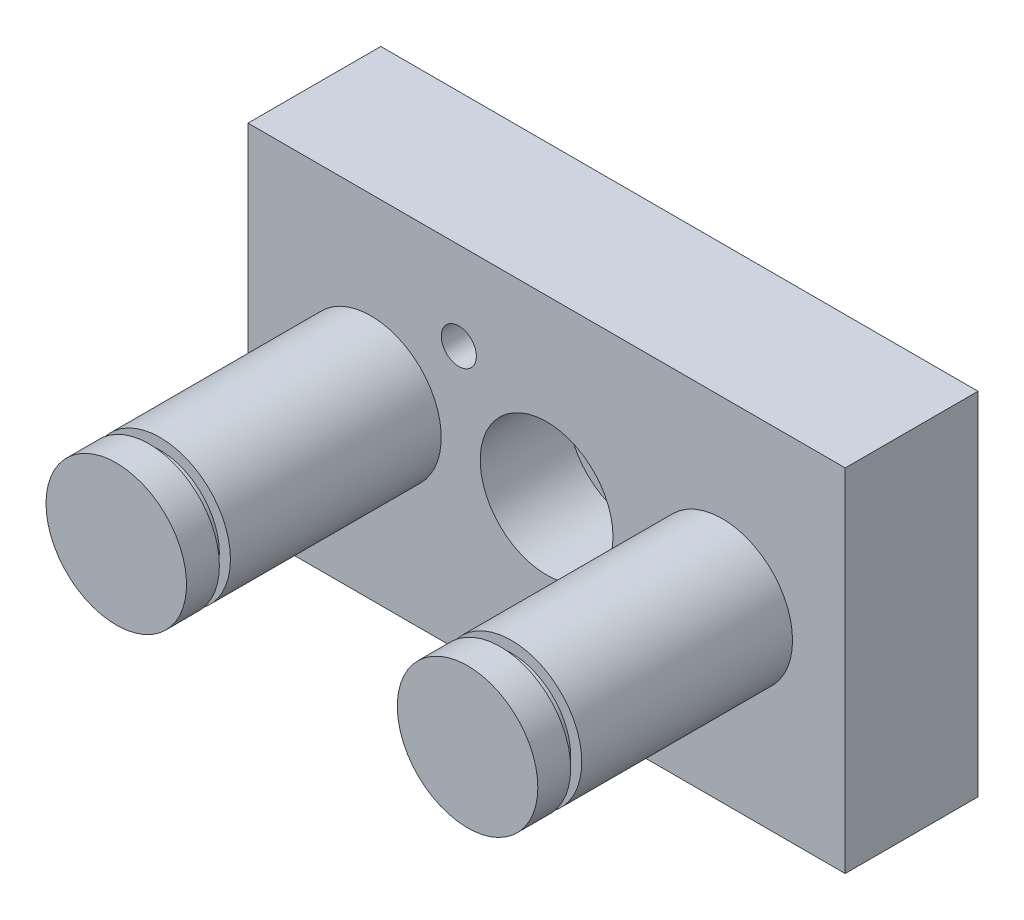
ISO-10303-21;
HEADER;
FILE_DESCRIPTION(('STEP AP214'),'2;1');
FILE_NAME('part.step','',(''),(''),'','','');
FILE_SCHEMA(('AUTOMOTIVE_DESIGN { 1 0 10303 214 1 1 1 1 }'));
ENDSEC;
DATA;
#1=APPLICATION_CONTEXT('core data for automotive mechanical design processes');
#2=APPLICATION_PROTOCOL_DEFINITION('international standard','automotive_design',2000,#1);
#3=PRODUCT_CONTEXT('',#1,'mechanical');
#4=PRODUCT('Part','Part','',(#3));
#5=PRODUCT_RELATED_PRODUCT_CATEGORY('part','',(#4));
#6=PRODUCT_DEFINITION_FORMATION('','',#4);
#7=PRODUCT_DEFINITION_CONTEXT('part definition',#1,'design');
#8=PRODUCT_DEFINITION('design','',#6,#7);
#9=PRODUCT_DEFINITION_SHAPE('','',#8);
#10=(LENGTH_UNIT() NAMED_UNIT(*) SI_UNIT(.MILLI.,.METRE.));
#11=(NAMED_UNIT(*) PLANE_ANGLE_UNIT() SI_UNIT($,.RADIAN.));
#12=(NAMED_UNIT(*) SI_UNIT($,.STERADIAN.) SOLID_ANGLE_UNIT());
#13=UNCERTAINTY_MEASURE_WITH_UNIT(LENGTH_MEASURE(1.E-05),#10,'distance_accuracy_value','');
#14=(GEOMETRIC_REPRESENTATION_CONTEXT(3) GLOBAL_UNCERTAINTY_ASSIGNED_CONTEXT((#13)) GLOBAL_UNIT_ASSIGNED_CONTEXT((#10,
#11,#12)) REPRESENTATION_CONTEXT('',''));
#15=CARTESIAN_POINT('',(0.,0.,0.));
#16=DIRECTION('',(0.,0.,1.));
#17=DIRECTION('',(1.,0.,0.));
#18=AXIS2_PLACEMENT_3D('',#15,#16,#17);
#19=CARTESIAN_POINT('',(15.875,0.,12.));
#20=DIRECTION('',(0.,0.,1.));
#21=DIRECTION('',(1.,0.,0.));
#22=AXIS2_PLACEMENT_3D('',#19,#20,#21);
#23=CYLINDRICAL_SURFACE('',#22,6.35);
#24=CARTESIAN_POINT('',(15.875,0.,31.05));
#25=DIRECTION('',(0.,0.,1.));
#26=DIRECTION('',(1.,0.,0.));
#27=AXIS2_PLACEMENT_3D('',#24,#25,#26);
#28=CIRCLE('',#27,6.35);
#29=CARTESIAN_POINT('',(22.225,0.,31.05));
#30=VERTEX_POINT('',#29);
#31=EDGE_CURVE('E61',#30,#30,#28,.T.);
#32=ORIENTED_EDGE('',*,*,#31,.F.);
#33=EDGE_LOOP('',(#32));
#34=FACE_BOUND('',#33,.T.);
#35=CARTESIAN_POINT('',(15.875,0.,12.));
#36=DIRECTION('',(0.,0.,1.));
#37=DIRECTION('',(1.,0.,0.));
#38=AXIS2_PLACEMENT_3D('',#35,#36,#37);
#39=CIRCLE('',#38,6.35);
#40=CARTESIAN_POINT('',(22.225,0.,12.));
#41=VERTEX_POINT('',#40);
#42=EDGE_CURVE('E48',#41,#41,#39,.T.);
#43=ORIENTED_EDGE('',*,*,#42,.T.);
#44=EDGE_LOOP('',(#43));
#45=FACE_BOUND('',#44,.T.);
#46=ADVANCED_FACE('F41',(#34,#45),#23,.T.);
#47=CARTESIAN_POINT('',(11.906,0.,1.19099999999999));
#48=DIRECTION('',(0.,0.,1.));
#49=DIRECTION('',(1.,0.,0.));
#50=AXIS2_PLACEMENT_3D('',#47,#48,#49);
#51=PLANE('',#50);
#52=CARTESIAN_POINT('',(15.875,0.,1.19099999999999));
#53=DIRECTION('',(0.,0.,1.));
#54=DIRECTION('',(1.,0.,0.));
#55=AXIS2_PLACEMENT_3D('',#52,#53,#54);
#56=CIRCLE('',#55,3.969);
#57=CARTESIAN_POINT('',(19.844,0.,1.19099999999999));
#58=VERTEX_POINT('',#57);
#59=EDGE_CURVE('E56',#58,#58,#56,.T.);
#60=ORIENTED_EDGE('',*,*,#59,.F.);
#61=EDGE_LOOP('',(#60));
#62=FACE_BOUND('',#61,.T.);
#63=ADVANCED_FACE('F43',(#62),#51,.F.);
#64=CARTESIAN_POINT('',(9.525,0.,12.));
#65=DIRECTION('',(0.,0.,1.));
#66=DIRECTION('',(1.,0.,0.));
#67=AXIS2_PLACEMENT_3D('',#64,#65,#66);
#68=PLANE('',#67);
#69=ORIENTED_EDGE('',*,*,#42,.F.);
#70=EDGE_LOOP('',(#69));
#71=FACE_BOUND('',#70,.T.);
#72=CARTESIAN_POINT('',(15.875,0.,12.));
#73=DIRECTION('',(0.,0.,1.));
#74=DIRECTION('',(1.,0.,0.));
#75=AXIS2_PLACEMENT_3D('',#72,#73,#74);
#76=CIRCLE('',#75,3.969);
#77=CARTESIAN_POINT('',(19.844,0.,12.));
#78=VERTEX_POINT('',#77);
#79=EDGE_CURVE('E52',#78,#78,#76,.T.);
#80=ORIENTED_EDGE('',*,*,#79,.T.);
#81=EDGE_LOOP('',(#80));
#82=FACE_BOUND('',#81,.T.);
#83=ADVANCED_FACE('F102',(#71,#82),#68,.F.);
#84=CARTESIAN_POINT('',(15.875,0.,12.));
#85=DIRECTION('',(0.,0.,1.));
#86=DIRECTION('',(1.,0.,0.));
#87=AXIS2_PLACEMENT_3D('',#84,#85,#86);
#88=CYLINDRICAL_SURFACE('',#87,3.969);
#89=ORIENTED_EDGE('',*,*,#79,.F.);
#90=EDGE_LOOP('',(#89));
#91=FACE_BOUND('',#90,.T.);
#92=ORIENTED_EDGE('',*,*,#59,.T.);
#93=EDGE_LOOP('',(#92));
#94=FACE_BOUND('',#93,.T.);
#95=ADVANCED_FACE('F93',(#91,#94),#88,.T.);
#96=CARTESIAN_POINT('',(22.225,0.,31.05));
#97=DIRECTION('',(0.,0.,-1.));
#98=DIRECTION('',(-1.,0.,0.));
#99=AXIS2_PLACEMENT_3D('',#96,#97,#98);
#100=PLANE('',#99);
#101=CARTESIAN_POINT('',(15.875,0.,31.05));
#102=DIRECTION('',(0.,0.,1.));
#103=DIRECTION('',(1.,0.,0.));
#104=AXIS2_PLACEMENT_3D('',#101,#102,#103);
#105=CIRCLE('',#104,5.35);
#106=CARTESIAN_POINT('',(21.225,0.,31.05));
#107=VERTEX_POINT('',#106);
#108=EDGE_CURVE('E64',#107,#107,#105,.T.);
#109=ORIENTED_EDGE('',*,*,#108,.F.);
#110=EDGE_LOOP('',(#109));
#111=FACE_BOUND('',#110,.T.);
#112=ORIENTED_EDGE('',*,*,#31,.T.);
#113=EDGE_LOOP('',(#112));
#114=FACE_BOUND('',#113,.T.);
#115=ADVANCED_FACE('F87',(#111,#114),#100,.F.);
#116=CARTESIAN_POINT('',(15.875,0.,35.019));
#117=DIRECTION('',(0.,0.,1.));
#118=DIRECTION('',(1.,0.,0.));
#119=AXIS2_PLACEMENT_3D('',#116,#117,#118);
#120=CYLINDRICAL_SURFACE('',#119,5.35);
#121=CARTESIAN_POINT('',(15.875,0.,32.05));
#122=DIRECTION('',(0.,0.,1.));
#123=DIRECTION('',(1.,0.,0.));
#124=AXIS2_PLACEMENT_3D('',#121,#122,#123);
#125=CIRCLE('',#124,5.35);
#126=CARTESIAN_POINT('',(21.225,0.,32.05));
#127=VERTEX_POINT('',#126);
#128=EDGE_CURVE('E67',#127,#127,#125,.T.);
#129=ORIENTED_EDGE('',*,*,#128,.F.);
#130=EDGE_LOOP('',(#129));
#131=FACE_BOUND('',#130,.T.);
#132=ORIENTED_EDGE('',*,*,#108,.T.);
#133=EDGE_LOOP('',(#132));
#134=FACE_BOUND('',#133,.T.);
#135=ADVANCED_FACE('F81',(#131,#134),#120,.T.);
#136=CARTESIAN_POINT('',(21.225,0.,32.05));
#137=DIRECTION('',(0.,0.,1.));
#138=DIRECTION('',(1.,0.,0.));
#139=AXIS2_PLACEMENT_3D('',#136,#137,#138);
#140=PLANE('',#139);
#141=CARTESIAN_POINT('',(15.875,0.,32.05));
#142=DIRECTION('',(0.,0.,1.));
#143=DIRECTION('',(1.,0.,0.));
#144=AXIS2_PLACEMENT_3D('',#141,#142,#143);
#145=CIRCLE('',#144,6.35);
#146=CARTESIAN_POINT('',(22.225,0.,32.05));
#147=VERTEX_POINT('',#146);
#148=EDGE_CURVE('E70',#147,#147,#145,.T.);
#149=ORIENTED_EDGE('',*,*,#148,.F.);
#150=EDGE_LOOP('',(#149));
#151=FACE_BOUND('',#150,.T.);
#152=ORIENTED_EDGE('',*,*,#128,.T.);
#153=EDGE_LOOP('',(#152));
#154=FACE_BOUND('',#153,.T.);
#155=ADVANCED_FACE('F77',(#151,#154),#140,.F.);
#156=CARTESIAN_POINT('',(15.875,0.,35.019));
#157=DIRECTION('',(0.,0.,-1.));
#158=DIRECTION('',(-1.,0.,0.));
#159=AXIS2_PLACEMENT_3D('',#156,#157,#158);
#160=PLANE('',#159);
#161=CARTESIAN_POINT('',(15.875,0.,35.019));
#162=DIRECTION('',(0.,0.,1.));
#163=DIRECTION('',(1.,0.,0.));
#164=AXIS2_PLACEMENT_3D('',#161,#162,#163);
#165=CIRCLE('',#164,6.35);
#166=CARTESIAN_POINT('',(22.225,0.,35.019));
#167=VERTEX_POINT('',#166);
#168=EDGE_CURVE('E11',#167,#167,#165,.T.);
#169=ORIENTED_EDGE('',*,*,#168,.T.);
#170=EDGE_LOOP('',(#169));
#171=FACE_BOUND('',#170,.T.);
#172=ADVANCED_FACE('F80',(#171),#160,.F.);
#173=ORIENTED_EDGE('',*,*,#148,.T.);
#174=EDGE_LOOP('',(#173));
#175=FACE_BOUND('',#174,.T.);
#176=ORIENTED_EDGE('',*,*,#168,.F.);
#177=EDGE_LOOP('',(#176));
#178=FACE_BOUND('',#177,.T.);
#179=ADVANCED_FACE('F74',(#175,#178),#23,.T.);
#180=CLOSED_SHELL('',(#46,#63,#83,#95,#115,#135,#155,#172,#179));
#181=MANIFOLD_SOLID_BREP('B2',#180);
#182=CARTESIAN_POINT('',(-15.875,0.,0.));
#183=DIRECTION('',(0.,0.,-1.));
#184=DIRECTION('',(-1.,0.,0.));
#185=AXIS2_PLACEMENT_3D('',#182,#183,#184);
#186=CYLINDRICAL_SURFACE('',#185,6.35);
#187=CARTESIAN_POINT('',(-15.875,0.,31.05));
#188=DIRECTION('',(0.,0.,1.));
#189=DIRECTION('',(1.,0.,0.));
#190=AXIS2_PLACEMENT_3D('',#187,#188,#189);
#191=CIRCLE('',#190,6.35);
#192=CARTESIAN_POINT('',(-9.525,0.,31.05));
#193=VERTEX_POINT('',#192);
#194=EDGE_CURVE('E199',#193,#193,#191,.T.);
#195=ORIENTED_EDGE('',*,*,#194,.F.);
#196=EDGE_LOOP('',(#195));
#197=FACE_BOUND('',#196,.T.);
#198=CARTESIAN_POINT('',(-15.875,0.,12.));
#199=DIRECTION('',(0.,0.,-1.));
#200=DIRECTION('',(-1.,0.,0.));
#201=AXIS2_PLACEMENT_3D('',#198,#199,#200);
#202=CIRCLE('',#201,6.35);
#203=CARTESIAN_POINT('',(-22.225,0.,12.));
#204=VERTEX_POINT('',#203);
#205=EDGE_CURVE('E186',#204,#204,#202,.T.);
#206=ORIENTED_EDGE('',*,*,#205,.F.);
#207=EDGE_LOOP('',(#206));
#208=FACE_BOUND('',#207,.T.);
#209=ADVANCED_FACE('F179',(#197,#208),#186,.T.);
#210=CARTESIAN_POINT('',(-11.906,0.,1.19099999999999));
#211=DIRECTION('',(0.,0.,1.));
#212=DIRECTION('',(1.,0.,0.));
#213=AXIS2_PLACEMENT_3D('',#210,#211,#212);
#214=PLANE('',#213);
#215=CARTESIAN_POINT('',(-15.875,0.,1.19099999999999));
#216=DIRECTION('',(0.,0.,-1.));
#217=DIRECTION('',(-1.,0.,0.));
#218=AXIS2_PLACEMENT_3D('',#215,#216,#217);
#219=CIRCLE('',#218,3.969);
#220=CARTESIAN_POINT('',(-19.844,0.,1.19099999999999));
#221=VERTEX_POINT('',#220);
#222=EDGE_CURVE('E194',#221,#221,#219,.T.);
#223=ORIENTED_EDGE('',*,*,#222,.T.);
#224=EDGE_LOOP('',(#223));
#225=FACE_BOUND('',#224,.T.);
#226=ADVANCED_FACE('F181',(#225),#214,.F.);
#227=CARTESIAN_POINT('',(-9.525,0.,12.));
#228=DIRECTION('',(0.,0.,1.));
#229=DIRECTION('',(1.,0.,0.));
#230=AXIS2_PLACEMENT_3D('',#227,#228,#229);
#231=PLANE('',#230);
#232=CARTESIAN_POINT('',(-15.875,0.,12.));
#233=DIRECTION('',(0.,0.,-1.));
#234=DIRECTION('',(-1.,0.,0.));
#235=AXIS2_PLACEMENT_3D('',#232,#233,#234);
#236=CIRCLE('',#235,3.969);
#237=CARTESIAN_POINT('',(-19.844,0.,12.));
#238=VERTEX_POINT('',#237);
#239=EDGE_CURVE('E190',#238,#238,#236,.T.);
#240=ORIENTED_EDGE('',*,*,#239,.F.);
#241=EDGE_LOOP('',(#240));
#242=FACE_BOUND('',#241,.T.);
#243=ORIENTED_EDGE('',*,*,#205,.T.);
#244=EDGE_LOOP('',(#243));
#245=FACE_BOUND('',#244,.T.);
#246=ADVANCED_FACE('F240',(#242,#245),#231,.F.);
#247=CARTESIAN_POINT('',(-15.875,0.,0.));
#248=DIRECTION('',(0.,0.,-1.));
#249=DIRECTION('',(-1.,0.,0.));
#250=AXIS2_PLACEMENT_3D('',#247,#248,#249);
#251=CYLINDRICAL_SURFACE('',#250,3.969);
#252=ORIENTED_EDGE('',*,*,#222,.F.);
#253=EDGE_LOOP('',(#252));
#254=FACE_BOUND('',#253,.T.);
#255=ORIENTED_EDGE('',*,*,#239,.T.);
#256=EDGE_LOOP('',(#255));
#257=FACE_BOUND('',#256,.T.);
#258=ADVANCED_FACE('F230',(#254,#257),#251,.T.);
#259=CARTESIAN_POINT('',(-9.525,0.,31.05));
#260=DIRECTION('',(0.,0.,-1.));
#261=DIRECTION('',(-1.,0.,0.));
#262=AXIS2_PLACEMENT_3D('',#259,#260,#261);
#263=PLANE('',#262);
#264=CARTESIAN_POINT('',(-15.875,0.,31.05));
#265=DIRECTION('',(0.,0.,1.));
#266=DIRECTION('',(1.,0.,0.));
#267=AXIS2_PLACEMENT_3D('',#264,#265,#266);
#268=CIRCLE('',#267,5.35);
#269=CARTESIAN_POINT('',(-10.525,0.,31.05));
#270=VERTEX_POINT('',#269);
#271=EDGE_CURVE('E202',#270,#270,#268,.T.);
#272=ORIENTED_EDGE('',*,*,#271,.F.);
#273=EDGE_LOOP('',(#272));
#274=FACE_BOUND('',#273,.T.);
#275=ORIENTED_EDGE('',*,*,#194,.T.);
#276=EDGE_LOOP('',(#275));
#277=FACE_BOUND('',#276,.T.);
#278=ADVANCED_FACE('F224',(#274,#277),#263,.F.);
#279=CARTESIAN_POINT('',(-15.875,0.,35.019));
#280=DIRECTION('',(0.,0.,1.));
#281=DIRECTION('',(1.,0.,0.));
#282=AXIS2_PLACEMENT_3D('',#279,#280,#281);
#283=CYLINDRICAL_SURFACE('',#282,5.35);
#284=CARTESIAN_POINT('',(-15.875,0.,32.05));
#285=DIRECTION('',(0.,0.,1.));
#286=DIRECTION('',(1.,0.,0.));
#287=AXIS2_PLACEMENT_3D('',#284,#285,#286);
#288=CIRCLE('',#287,5.35);
#289=CARTESIAN_POINT('',(-10.525,0.,32.05));
#290=VERTEX_POINT('',#289);
#291=EDGE_CURVE('E205',#290,#290,#288,.T.);
#292=ORIENTED_EDGE('',*,*,#291,.F.);
#293=EDGE_LOOP('',(#292));
#294=FACE_BOUND('',#293,.T.);
#295=ORIENTED_EDGE('',*,*,#271,.T.);
#296=EDGE_LOOP('',(#295));
#297=FACE_BOUND('',#296,.T.);
#298=ADVANCED_FACE('F218',(#294,#297),#283,.T.);
#299=CARTESIAN_POINT('',(-10.525,0.,32.05));
#300=DIRECTION('',(0.,0.,1.));
#301=DIRECTION('',(1.,0.,0.));
#302=AXIS2_PLACEMENT_3D('',#299,#300,#301);
#303=PLANE('',#302);
#304=CARTESIAN_POINT('',(-15.875,0.,32.05));
#305=DIRECTION('',(0.,0.,1.));
#306=DIRECTION('',(1.,0.,0.));
#307=AXIS2_PLACEMENT_3D('',#304,#305,#306);
#308=CIRCLE('',#307,6.35);
#309=CARTESIAN_POINT('',(-9.525,0.,32.05));
#310=VERTEX_POINT('',#309);
#311=EDGE_CURVE('E208',#310,#310,#308,.T.);
#312=ORIENTED_EDGE('',*,*,#311,.F.);
#313=EDGE_LOOP('',(#312));
#314=FACE_BOUND('',#313,.T.);
#315=ORIENTED_EDGE('',*,*,#291,.T.);
#316=EDGE_LOOP('',(#315));
#317=FACE_BOUND('',#316,.T.);
#318=ADVANCED_FACE('F214',(#314,#317),#303,.F.);
#319=CARTESIAN_POINT('',(-15.875,0.,35.019));
#320=DIRECTION('',(0.,0.,-1.));
#321=DIRECTION('',(-1.,0.,0.));
#322=AXIS2_PLACEMENT_3D('',#319,#320,#321);
#323=PLANE('',#322);
#324=CARTESIAN_POINT('',(-15.875,0.,35.019));
#325=DIRECTION('',(0.,0.,-1.));
#326=DIRECTION('',(-1.,0.,0.));
#327=AXIS2_PLACEMENT_3D('',#324,#325,#326);
#328=CIRCLE('',#327,6.35);
#329=CARTESIAN_POINT('',(-22.225,0.,35.019));
#330=VERTEX_POINT('',#329);
#331=EDGE_CURVE('E40',#330,#330,#328,.T.);
#332=ORIENTED_EDGE('',*,*,#331,.F.);
#333=EDGE_LOOP('',(#332));
#334=FACE_BOUND('',#333,.T.);
#335=ADVANCED_FACE('F217',(#334),#323,.F.);
#336=ORIENTED_EDGE('',*,*,#311,.T.);
#337=EDGE_LOOP('',(#336));
#338=FACE_BOUND('',#337,.T.);
#339=ORIENTED_EDGE('',*,*,#331,.T.);
#340=EDGE_LOOP('',(#339));
#341=FACE_BOUND('',#340,.T.);
#342=ADVANCED_FACE('F212',(#338,#341),#186,.T.);
#343=CLOSED_SHELL('',(#209,#226,#246,#258,#278,#298,#318,#335,#342));
#344=MANIFOLD_SOLID_BREP('B6',#343);
#345=CARTESIAN_POINT('',(0.,0.,0.));
#346=DIRECTION('',(0.,0.,1.));
#347=DIRECTION('',(1.,0.,0.));
#348=AXIS2_PLACEMENT_3D('',#345,#346,#347);
#349=CYLINDRICAL_SURFACE('',#348,3.969);
#350=CARTESIAN_POINT('',(0.,0.,0.));
#351=DIRECTION('',(0.,0.,1.));
#352=DIRECTION('',(1.,0.,0.));
#353=AXIS2_PLACEMENT_3D('',#350,#351,#352);
#354=CIRCLE('',#353,3.969);
#355=CARTESIAN_POINT('',(3.969,0.,0.));
#356=VERTEX_POINT('',#355);
#357=EDGE_CURVE('E377',#356,#356,#354,.T.);
#358=ORIENTED_EDGE('',*,*,#357,.F.);
#359=EDGE_LOOP('',(#358));
#360=FACE_BOUND('',#359,.T.);
#361=CARTESIAN_POINT('',(0.,0.,4.062));
#362=DIRECTION('',(0.,0.,1.));
#363=DIRECTION('',(1.,0.,0.));
#364=AXIS2_PLACEMENT_3D('',#361,#362,#363);
#365=CIRCLE('',#364,3.969);
#366=CARTESIAN_POINT('',(3.969,0.,4.062));
#367=VERTEX_POINT('',#366);
#368=EDGE_CURVE('E312',#367,#367,#365,.F.);
#369=ORIENTED_EDGE('',*,*,#368,.F.);
#370=EDGE_LOOP('',(#369));
#371=FACE_BOUND('',#370,.T.);
#372=ADVANCED_FACE('F308',(#360,#371),#349,.F.);
#373=CARTESIAN_POINT('',(26.9875,15.875,12.));
#374=DIRECTION('',(-1.,0.,0.));
#375=DIRECTION('',(0.,0.,1.));
#376=AXIS2_PLACEMENT_3D('',#373,#374,#375);
#377=PLANE('',#376);
#378=DIRECTION('',(0.,1.,0.));
#379=VECTOR('',#378,1.);
#380=CARTESIAN_POINT('',(26.9875,15.875,0.));
#381=LINE('',#380,#379);
#382=CARTESIAN_POINT('',(26.9875,-15.875,0.));
#383=VERTEX_POINT('',#382);
#384=CARTESIAN_POINT('',(26.9875,15.875,0.));
#385=VERTEX_POINT('',#384);
#386=EDGE_CURVE('E374',#383,#385,#381,.T.);
#387=ORIENTED_EDGE('',*,*,#386,.T.);
#388=DIRECTION('',(0.,0.,-1.));
#389=VECTOR('',#388,1.);
#390=CARTESIAN_POINT('',(26.9875,15.875,12.));
#391=LINE('',#390,#389);
#392=CARTESIAN_POINT('',(26.9875,15.875,12.));
#393=VERTEX_POINT('',#392);
#394=EDGE_CURVE('E177',#393,#385,#391,.T.);
#395=ORIENTED_EDGE('',*,*,#394,.F.);
#396=DIRECTION('',(0.,1.,0.));
#397=VECTOR('',#396,1.);
#398=CARTESIAN_POINT('',(26.9875,15.875,12.));
#399=LINE('',#398,#397);
#400=CARTESIAN_POINT('',(26.9875,-15.875,12.));
#401=VERTEX_POINT('',#400);
#402=EDGE_CURVE('E361',#401,#393,#399,.T.);
#403=ORIENTED_EDGE('',*,*,#402,.F.);
#404=DIRECTION('',(0.,0.,-1.));
#405=VECTOR('',#404,1.);
#406=CARTESIAN_POINT('',(26.9875,-15.875,12.));
#407=LINE('',#406,#405);
#408=EDGE_CURVE('E370',#401,#383,#407,.T.);
#409=ORIENTED_EDGE('',*,*,#408,.T.);
#410=EDGE_LOOP('',(#387,#395,#403,#409));
#411=FACE_BOUND('',#410,.T.);
#412=ADVANCED_FACE('F310',(#411),#377,.F.);
#413=CARTESIAN_POINT('',(-26.9875,15.875,12.));
#414=DIRECTION('',(0.,-1.,0.));
#415=DIRECTION('',(0.,0.,-1.));
#416=AXIS2_PLACEMENT_3D('',#413,#414,#415);
#417=PLANE('',#416);
#418=DIRECTION('',(-1.,0.,0.));
#419=VECTOR('',#418,1.);
#420=CARTESIAN_POINT('',(-26.9875,15.875,0.));
#421=LINE('',#420,#419);
#422=CARTESIAN_POINT('',(-26.9875,15.875,0.));
#423=VERTEX_POINT('',#422);
#424=EDGE_CURVE('E365',#385,#423,#421,.T.);
#425=ORIENTED_EDGE('',*,*,#424,.T.);
#426=DIRECTION('',(0.,0.,-1.));
#427=VECTOR('',#426,1.);
#428=CARTESIAN_POINT('',(-26.9875,15.875,12.));
#429=LINE('',#428,#427);
#430=CARTESIAN_POINT('',(-26.9875,15.875,12.));
#431=VERTEX_POINT('',#430);
#432=EDGE_CURVE('E318',#431,#423,#429,.T.);
#433=ORIENTED_EDGE('',*,*,#432,.F.);
#434=DIRECTION('',(-1.,0.,0.));
#435=VECTOR('',#434,1.);
#436=CARTESIAN_POINT('',(-26.9875,15.875,12.));
#437=LINE('',#436,#435);
#438=EDGE_CURVE('E356',#393,#431,#437,.T.);
#439=ORIENTED_EDGE('',*,*,#438,.F.);
#440=ORIENTED_EDGE('',*,*,#394,.T.);
#441=EDGE_LOOP('',(#425,#433,#439,#440));
#442=FACE_BOUND('',#441,.T.);
#443=ADVANCED_FACE('F364',(#442),#417,.F.);
#444=CARTESIAN_POINT('',(-26.9875,15.875,12.));
#445=DIRECTION('',(1.,0.,0.));
#446=DIRECTION('',(0.,0.,-1.));
#447=AXIS2_PLACEMENT_3D('',#444,#445,#446);
#448=PLANE('',#447);
#449=DIRECTION('',(0.,-1.,0.));
#450=VECTOR('',#449,1.);
#451=CARTESIAN_POINT('',(-26.9875,15.875,0.));
#452=LINE('',#451,#450);
#453=CARTESIAN_POINT('',(-26.9875,-15.875,0.));
#454=VERTEX_POINT('',#453);
#455=EDGE_CURVE('E343',#423,#454,#452,.T.);
#456=ORIENTED_EDGE('',*,*,#455,.T.);
#457=DIRECTION('',(0.,0.,-1.));
#458=VECTOR('',#457,1.);
#459=CARTESIAN_POINT('',(-26.9875,-15.875,12.));
#460=LINE('',#459,#458);
#461=CARTESIAN_POINT('',(-26.9875,-15.875,12.));
#462=VERTEX_POINT('',#461);
#463=EDGE_CURVE('E366',#462,#454,#460,.T.);
#464=ORIENTED_EDGE('',*,*,#463,.F.);
#465=DIRECTION('',(0.,-1.,0.));
#466=VECTOR('',#465,1.);
#467=CARTESIAN_POINT('',(-26.9875,15.875,12.));
#468=LINE('',#467,#466);
#469=EDGE_CURVE('E359',#431,#462,#468,.T.);
#470=ORIENTED_EDGE('',*,*,#469,.F.);
#471=ORIENTED_EDGE('',*,*,#432,.T.);
#472=EDGE_LOOP('',(#456,#464,#470,#471));
#473=FACE_BOUND('',#472,.T.);
#474=ADVANCED_FACE('F368',(#473),#448,.F.);
#475=CARTESIAN_POINT('',(-26.9875,-15.875,12.));
#476=DIRECTION('',(0.,1.,0.));
#477=DIRECTION('',(0.,0.,1.));
#478=AXIS2_PLACEMENT_3D('',#475,#476,#477);
#479=PLANE('',#478);
#480=DIRECTION('',(1.,0.,0.));
#481=VECTOR('',#480,1.);
#482=CARTESIAN_POINT('',(-26.9875,-15.875,0.));
#483=LINE('',#482,#481);
#484=EDGE_CURVE('E349',#454,#383,#483,.T.);
#485=ORIENTED_EDGE('',*,*,#484,.T.);
#486=ORIENTED_EDGE('',*,*,#408,.F.);
#487=DIRECTION('',(1.,0.,0.));
#488=VECTOR('',#487,1.);
#489=CARTESIAN_POINT('',(-26.9875,-15.875,12.));
#490=LINE('',#489,#488);
#491=EDGE_CURVE('E326',#462,#401,#490,.T.);
#492=ORIENTED_EDGE('',*,*,#491,.F.);
#493=ORIENTED_EDGE('',*,*,#463,.T.);
#494=EDGE_LOOP('',(#485,#486,#492,#493));
#495=FACE_BOUND('',#494,.T.);
#496=ADVANCED_FACE('F382',(#495),#479,.F.);
#497=CARTESIAN_POINT('',(0.,0.,12.));
#498=DIRECTION('',(0.,0.,1.));
#499=DIRECTION('',(1.,0.,0.));
#500=AXIS2_PLACEMENT_3D('',#497,#498,#499);
#501=PLANE('',#500);
#502=CARTESIAN_POINT('',(15.875,0.,12.));
#503=DIRECTION('',(0.,0.,1.));
#504=DIRECTION('',(1.,0.,0.));
#505=AXIS2_PLACEMENT_3D('',#502,#503,#504);
#506=CIRCLE('',#505,3.969);
#507=CARTESIAN_POINT('',(19.844,0.,12.));
#508=VERTEX_POINT('',#507);
#509=EDGE_CURVE('E415',#508,#508,#506,.T.);
#510=ORIENTED_EDGE('',*,*,#509,.F.);
#511=EDGE_LOOP('',(#510));
#512=FACE_BOUND('',#511,.T.);
#513=CARTESIAN_POINT('',(-15.875,0.,12.));
#514=DIRECTION('',(0.,0.,1.));
#515=DIRECTION('',(1.,0.,0.));
#516=AXIS2_PLACEMENT_3D('',#513,#514,#515);
#517=CIRCLE('',#516,3.969);
#518=CARTESIAN_POINT('',(-11.906,0.,12.));
#519=VERTEX_POINT('',#518);
#520=EDGE_CURVE('E409',#519,#519,#517,.T.);
#521=ORIENTED_EDGE('',*,*,#520,.F.);
#522=EDGE_LOOP('',(#521));
#523=FACE_BOUND('',#522,.T.);
#524=CARTESIAN_POINT('',(-7.93750000000003,7.93749999999995,12.));
#525=DIRECTION('',(0.,0.,1.));
#526=DIRECTION('',(1.,0.,0.));
#527=AXIS2_PLACEMENT_3D('',#524,#525,#526);
#528=CIRCLE('',#527,1.5875);
#529=CARTESIAN_POINT('',(-6.35000000000003,7.93749999999995,12.));
#530=VERTEX_POINT('',#529);
#531=EDGE_CURVE('E403',#530,#530,#528,.T.);
#532=ORIENTED_EDGE('',*,*,#531,.F.);
#533=EDGE_LOOP('',(#532));
#534=FACE_BOUND('',#533,.T.);
#535=CARTESIAN_POINT('',(7.93749999999997,-7.93750000000002,12.));
#536=DIRECTION('',(0.,0.,1.));
#537=DIRECTION('',(1.,0.,0.));
#538=AXIS2_PLACEMENT_3D('',#535,#536,#537);
#539=CIRCLE('',#538,1.5875);
#540=CARTESIAN_POINT('',(9.52499999999997,-7.93750000000002,12.));
#541=VERTEX_POINT('',#540);
#542=EDGE_CURVE('E397',#541,#541,#539,.T.);
#543=ORIENTED_EDGE('',*,*,#542,.F.);
#544=EDGE_LOOP('',(#543));
#545=FACE_BOUND('',#544,.T.);
#546=CARTESIAN_POINT('',(0.,0.,12.));
#547=DIRECTION('',(0.,0.,1.));
#548=DIRECTION('',(1.,0.,0.));
#549=AXIS2_PLACEMENT_3D('',#546,#547,#548);
#550=CIRCLE('',#549,6.0015);
#551=CARTESIAN_POINT('',(6.0015,0.,12.));
#552=VERTEX_POINT('',#551);
#553=EDGE_CURVE('E390',#552,#552,#550,.T.);
#554=ORIENTED_EDGE('',*,*,#553,.F.);
#555=EDGE_LOOP('',(#554));
#556=FACE_BOUND('',#555,.T.);
#557=ORIENTED_EDGE('',*,*,#402,.T.);
#558=ORIENTED_EDGE('',*,*,#438,.T.);
#559=ORIENTED_EDGE('',*,*,#469,.T.);
#560=ORIENTED_EDGE('',*,*,#491,.T.);
#561=EDGE_LOOP('',(#557,#558,#559,#560));
#562=FACE_BOUND('',#561,.T.);
#563=ADVANCED_FACE('F357',(#512,#523,#534,#545,#556,#562),#501,.T.);
#564=CARTESIAN_POINT('',(0.,0.,0.));
#565=DIRECTION('',(0.,0.,1.));
#566=DIRECTION('',(1.,0.,0.));
#567=AXIS2_PLACEMENT_3D('',#564,#565,#566);
#568=PLANE('',#567);
#569=CARTESIAN_POINT('',(15.875,0.,0.));
#570=DIRECTION('',(0.,0.,1.));
#571=DIRECTION('',(1.,0.,0.));
#572=AXIS2_PLACEMENT_3D('',#569,#570,#571);
#573=CIRCLE('',#572,3.969);
#574=CARTESIAN_POINT('',(19.844,0.,0.));
#575=VERTEX_POINT('',#574);
#576=EDGE_CURVE('E412',#575,#575,#573,.T.);
#577=ORIENTED_EDGE('',*,*,#576,.T.);
#578=EDGE_LOOP('',(#577));
#579=FACE_BOUND('',#578,.T.);
#580=CARTESIAN_POINT('',(-15.875,0.,0.));
#581=DIRECTION('',(0.,0.,1.));
#582=DIRECTION('',(1.,0.,0.));
#583=AXIS2_PLACEMENT_3D('',#580,#581,#582);
#584=CIRCLE('',#583,3.969);
#585=CARTESIAN_POINT('',(-11.906,0.,0.));
#586=VERTEX_POINT('',#585);
#587=EDGE_CURVE('E406',#586,#586,#584,.T.);
#588=ORIENTED_EDGE('',*,*,#587,.T.);
#589=EDGE_LOOP('',(#588));
#590=FACE_BOUND('',#589,.T.);
#591=CARTESIAN_POINT('',(-7.93750000000003,7.93749999999995,0.));
#592=DIRECTION('',(0.,0.,1.));
#593=DIRECTION('',(1.,0.,0.));
#594=AXIS2_PLACEMENT_3D('',#591,#592,#593);
#595=CIRCLE('',#594,1.5875);
#596=CARTESIAN_POINT('',(-6.35000000000003,7.93749999999995,0.));
#597=VERTEX_POINT('',#596);
#598=EDGE_CURVE('E400',#597,#597,#595,.T.);
#599=ORIENTED_EDGE('',*,*,#598,.T.);
#600=EDGE_LOOP('',(#599));
#601=FACE_BOUND('',#600,.T.);
#602=CARTESIAN_POINT('',(7.93749999999997,-7.93750000000002,0.));
#603=DIRECTION('',(0.,0.,1.));
#604=DIRECTION('',(1.,0.,0.));
#605=AXIS2_PLACEMENT_3D('',#602,#603,#604);
#606=CIRCLE('',#605,1.5875);
#607=CARTESIAN_POINT('',(9.52499999999997,-7.93750000000002,0.));
#608=VERTEX_POINT('',#607);
#609=EDGE_CURVE('E394',#608,#608,#606,.T.);
#610=ORIENTED_EDGE('',*,*,#609,.T.);
#611=EDGE_LOOP('',(#610));
#612=FACE_BOUND('',#611,.T.);
#613=ORIENTED_EDGE('',*,*,#357,.T.);
#614=EDGE_LOOP('',(#613));
#615=FACE_BOUND('',#614,.T.);
#616=ORIENTED_EDGE('',*,*,#386,.F.);
#617=ORIENTED_EDGE('',*,*,#484,.F.);
#618=ORIENTED_EDGE('',*,*,#455,.F.);
#619=ORIENTED_EDGE('',*,*,#424,.F.);
#620=EDGE_LOOP('',(#616,#617,#618,#619));
#621=FACE_BOUND('',#620,.T.);
#622=ADVANCED_FACE('F385',(#579,#590,#601,#612,#615,#621),#568,.F.);
#623=CARTESIAN_POINT('',(0.,0.,4.062));
#624=DIRECTION('',(0.,0.,1.));
#625=DIRECTION('',(1.,0.,0.));
#626=AXIS2_PLACEMENT_3D('',#623,#624,#625);
#627=PLANE('',#626);
#628=CARTESIAN_POINT('',(0.,0.,4.062));
#629=DIRECTION('',(0.,0.,1.));
#630=DIRECTION('',(1.,0.,0.));
#631=AXIS2_PLACEMENT_3D('',#628,#629,#630);
#632=CIRCLE('',#631,6.0015);
#633=CARTESIAN_POINT('',(6.0015,0.,4.062));
#634=VERTEX_POINT('',#633);
#635=EDGE_CURVE('E393',#634,#634,#632,.T.);
#636=ORIENTED_EDGE('',*,*,#635,.T.);
#637=EDGE_LOOP('',(#636));
#638=FACE_BOUND('',#637,.T.);
#639=ORIENTED_EDGE('',*,*,#368,.T.);
#640=EDGE_LOOP('',(#639));
#641=FACE_BOUND('',#640,.T.);
#642=ADVANCED_FACE('F444',(#638,#641),#627,.T.);
#643=CARTESIAN_POINT('',(0.,0.,4.062));
#644=DIRECTION('',(0.,0.,1.));
#645=DIRECTION('',(1.,0.,0.));
#646=AXIS2_PLACEMENT_3D('',#643,#644,#645);
#647=CYLINDRICAL_SURFACE('',#646,6.0015);
#648=ORIENTED_EDGE('',*,*,#635,.F.);
#649=EDGE_LOOP('',(#648));
#650=FACE_BOUND('',#649,.T.);
#651=ORIENTED_EDGE('',*,*,#553,.T.);
#652=EDGE_LOOP('',(#651));
#653=FACE_BOUND('',#652,.T.);
#654=ADVANCED_FACE('F441',(#650,#653),#647,.F.);
#655=CARTESIAN_POINT('',(7.93749999999997,-7.93750000000002,0.));
#656=DIRECTION('',(0.,0.,1.));
#657=DIRECTION('',(1.,0.,0.));
#658=AXIS2_PLACEMENT_3D('',#655,#656,#657);
#659=CYLINDRICAL_SURFACE('',#658,1.5875);
#660=ORIENTED_EDGE('',*,*,#609,.F.);
#661=EDGE_LOOP('',(#660));
#662=FACE_BOUND('',#661,.T.);
#663=ORIENTED_EDGE('',*,*,#542,.T.);
#664=EDGE_LOOP('',(#663));
#665=FACE_BOUND('',#664,.T.);
#666=ADVANCED_FACE('F443',(#662,#665),#659,.F.);
#667=CARTESIAN_POINT('',(-7.93750000000003,7.93749999999995,0.));
#668=DIRECTION('',(0.,0.,1.));
#669=DIRECTION('',(1.,0.,0.));
#670=AXIS2_PLACEMENT_3D('',#667,#668,#669);
#671=CYLINDRICAL_SURFACE('',#670,1.5875);
#672=ORIENTED_EDGE('',*,*,#598,.F.);
#673=EDGE_LOOP('',(#672));
#674=FACE_BOUND('',#673,.T.);
#675=ORIENTED_EDGE('',*,*,#531,.T.);
#676=EDGE_LOOP('',(#675));
#677=FACE_BOUND('',#676,.T.);
#678=ADVANCED_FACE('F451',(#674,#677),#671,.F.);
#679=CARTESIAN_POINT('',(-15.875,0.,0.));
#680=DIRECTION('',(0.,0.,1.));
#681=DIRECTION('',(1.,0.,0.));
#682=AXIS2_PLACEMENT_3D('',#679,#680,#681);
#683=CYLINDRICAL_SURFACE('',#682,3.969);
#684=ORIENTED_EDGE('',*,*,#587,.F.);
#685=EDGE_LOOP('',(#684));
#686=FACE_BOUND('',#685,.T.);
#687=ORIENTED_EDGE('',*,*,#520,.T.);
#688=EDGE_LOOP('',(#687));
#689=FACE_BOUND('',#688,.T.);
#690=ADVANCED_FACE('F426',(#686,#689),#683,.F.);
#691=CARTESIAN_POINT('',(15.875,0.,0.));
#692=DIRECTION('',(0.,0.,1.));
#693=DIRECTION('',(1.,0.,0.));
#694=AXIS2_PLACEMENT_3D('',#691,#692,#693);
#695=CYLINDRICAL_SURFACE('',#694,3.969);
#696=ORIENTED_EDGE('',*,*,#576,.F.);
#697=EDGE_LOOP('',(#696));
#698=FACE_BOUND('',#697,.T.);
#699=ORIENTED_EDGE('',*,*,#509,.T.);
#700=EDGE_LOOP('',(#699));
#701=FACE_BOUND('',#700,.T.);
#702=ADVANCED_FACE('F423',(#698,#701),#695,.F.);
#703=CLOSED_SHELL('',(#372,#412,#443,#474,#496,#563,#622,#642,#654,#666,#678,#690,#702));
#704=MANIFOLD_SOLID_BREP('B35',#703);
#705=ADVANCED_BREP_SHAPE_REPRESENTATION('',(#18,#181,#344,#704),#14);
#706=SHAPE_DEFINITION_REPRESENTATION(#9,#705);
ENDSEC;
END-ISO-10303-21;
